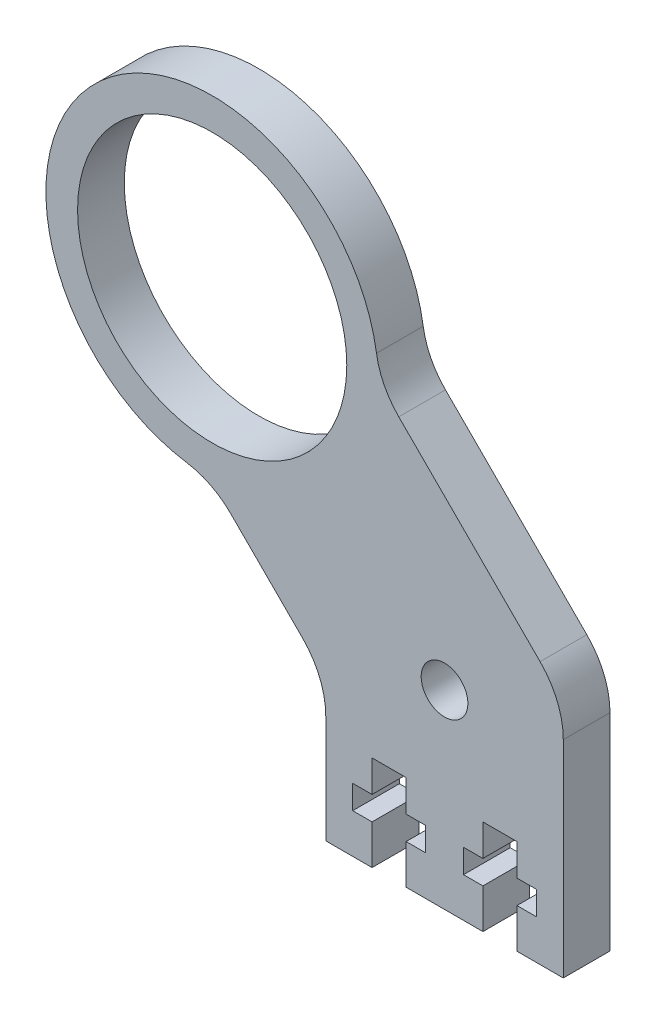
ISO-10303-21;
HEADER;
FILE_DESCRIPTION(('STEP AP214'),'2;1');
FILE_NAME('part.step','',(''),(''),'','','');
FILE_SCHEMA(('AUTOMOTIVE_DESIGN { 1 0 10303 214 1 1 1 1 }'));
ENDSEC;
DATA;
#1=APPLICATION_CONTEXT('core data for automotive mechanical design processes');
#2=APPLICATION_PROTOCOL_DEFINITION('international standard','automotive_design',2000,#1);
#3=PRODUCT_CONTEXT('',#1,'mechanical');
#4=PRODUCT('Part','Part','',(#3));
#5=PRODUCT_RELATED_PRODUCT_CATEGORY('part','',(#4));
#6=PRODUCT_DEFINITION_FORMATION('','',#4);
#7=PRODUCT_DEFINITION_CONTEXT('part definition',#1,'design');
#8=PRODUCT_DEFINITION('design','',#6,#7);
#9=PRODUCT_DEFINITION_SHAPE('','',#8);
#10=(LENGTH_UNIT() NAMED_UNIT(*) SI_UNIT(.MILLI.,.METRE.));
#11=(NAMED_UNIT(*) PLANE_ANGLE_UNIT() SI_UNIT($,.RADIAN.));
#12=(NAMED_UNIT(*) SI_UNIT($,.STERADIAN.) SOLID_ANGLE_UNIT());
#13=UNCERTAINTY_MEASURE_WITH_UNIT(LENGTH_MEASURE(1.E-05),#10,'distance_accuracy_value','');
#14=(GEOMETRIC_REPRESENTATION_CONTEXT(3) GLOBAL_UNCERTAINTY_ASSIGNED_CONTEXT((#13)) GLOBAL_UNIT_ASSIGNED_CONTEXT((#10,
#11,#12)) REPRESENTATION_CONTEXT('',''));
#15=CARTESIAN_POINT('',(0.,0.,0.));
#16=DIRECTION('',(0.,0.,1.));
#17=DIRECTION('',(1.,0.,0.));
#18=AXIS2_PLACEMENT_3D('',#15,#16,#17);
#19=CARTESIAN_POINT('',(-15.,-24.,5.9));
#20=DIRECTION('',(0.,1.,0.));
#21=DIRECTION('',(-1.,0.,0.));
#22=AXIS2_PLACEMENT_3D('',#19,#20,#21);
#23=PLANE('',#22);
#24=DIRECTION('',(1.,0.,0.));
#25=VECTOR('',#24,1.);
#26=CARTESIAN_POINT('',(-15.,-24.,5.9));
#27=LINE('',#26,#25);
#28=CARTESIAN_POINT('',(9.15000000000001,-24.,5.9));
#29=VERTEX_POINT('',#28);
#30=CARTESIAN_POINT('',(15.,-24.,5.9));
#31=VERTEX_POINT('',#30);
#32=EDGE_CURVE('E466',#29,#31,#27,.T.);
#33=ORIENTED_EDGE('',*,*,#32,.F.);
#34=DIRECTION('',(0.,0.,1.));
#35=VECTOR('',#34,1.);
#36=CARTESIAN_POINT('',(9.15000000000001,-24.,0.));
#37=LINE('',#36,#35);
#38=CARTESIAN_POINT('',(9.15000000000001,-24.,0.));
#39=VERTEX_POINT('',#38);
#40=EDGE_CURVE('E348',#39,#29,#37,.T.);
#41=ORIENTED_EDGE('',*,*,#40,.F.);
#42=DIRECTION('',(1.,0.,0.));
#43=VECTOR('',#42,1.);
#44=CARTESIAN_POINT('',(-15.,-24.,0.));
#45=LINE('',#44,#43);
#46=CARTESIAN_POINT('',(15.,-24.,0.));
#47=VERTEX_POINT('',#46);
#48=EDGE_CURVE('E483',#39,#47,#45,.T.);
#49=ORIENTED_EDGE('',*,*,#48,.T.);
#50=DIRECTION('',(0.,0.,-1.));
#51=VECTOR('',#50,1.);
#52=CARTESIAN_POINT('',(15.,-24.,5.9));
#53=LINE('',#52,#51);
#54=EDGE_CURVE('E476',#31,#47,#53,.T.);
#55=ORIENTED_EDGE('',*,*,#54,.F.);
#56=EDGE_LOOP('',(#33,#41,#49,#55));
#57=FACE_BOUND('',#56,.T.);
#58=ADVANCED_FACE('F32',(#57),#23,.F.);
#59=CARTESIAN_POINT('',(-15.,-24.,0.));
#60=VERTEX_POINT('',#59);
#61=CARTESIAN_POINT('',(-9.15,-24.,0.));
#62=VERTEX_POINT('',#61);
#63=EDGE_CURVE('E484',#60,#62,#45,.T.);
#64=ORIENTED_EDGE('',*,*,#63,.T.);
#65=DIRECTION('',(0.,0.,1.));
#66=VECTOR('',#65,1.);
#67=CARTESIAN_POINT('',(-9.15,-24.,0.));
#68=LINE('',#67,#66);
#69=CARTESIAN_POINT('',(-9.15,-24.,5.9));
#70=VERTEX_POINT('',#69);
#71=EDGE_CURVE('E390',#62,#70,#68,.T.);
#72=ORIENTED_EDGE('',*,*,#71,.T.);
#73=CARTESIAN_POINT('',(-15.,-24.,5.9));
#74=VERTEX_POINT('',#73);
#75=EDGE_CURVE('E467',#74,#70,#27,.T.);
#76=ORIENTED_EDGE('',*,*,#75,.F.);
#77=DIRECTION('',(0.,0.,-1.));
#78=VECTOR('',#77,1.);
#79=CARTESIAN_POINT('',(-15.,-24.,5.9));
#80=LINE('',#79,#78);
#81=EDGE_CURVE('E495',#74,#60,#80,.T.);
#82=ORIENTED_EDGE('',*,*,#81,.T.);
#83=EDGE_LOOP('',(#64,#72,#76,#82));
#84=FACE_BOUND('',#83,.T.);
#85=ADVANCED_FACE('F562',(#84),#23,.F.);
#86=CARTESIAN_POINT('',(-29.3449314192418,29.3449314192417,5.9));
#87=DIRECTION('',(0.,0.,1.));
#88=DIRECTION('',(1.,0.,0.));
#89=AXIS2_PLACEMENT_3D('',#86,#87,#88);
#90=PLANE('',#89);
#91=DIRECTION('',(0.,1.,0.));
#92=VECTOR('',#91,1.);
#93=CARTESIAN_POINT('',(15.,-24.,5.9));
#94=LINE('',#93,#92);
#95=CARTESIAN_POINT('',(15.,2.07106781186547,5.9));
#96=VERTEX_POINT('',#95);
#97=EDGE_CURVE('E470',#31,#96,#94,.T.);
#98=ORIENTED_EDGE('',*,*,#97,.T.);
#99=CARTESIAN_POINT('',(5.,2.07106781186548,5.9));
#100=DIRECTION('',(0.,0.,1.));
#101=DIRECTION('',(1.,0.,0.));
#102=AXIS2_PLACEMENT_3D('',#99,#100,#101);
#103=CIRCLE('',#102,10.);
#104=CARTESIAN_POINT('',(12.0710678118655,9.14213562373097,5.9));
#105=VERTEX_POINT('',#104);
#106=EDGE_CURVE('E515',#96,#105,#103,.T.);
#107=ORIENTED_EDGE('',*,*,#106,.T.);
#108=DIRECTION('',(-0.707106781186549,0.707106781186546,0.));
#109=VECTOR('',#108,1.);
#110=CARTESIAN_POINT('',(15.,6.21320343559644,5.9));
#111=LINE('',#110,#109);
#112=CARTESIAN_POINT('',(-5.77684830462785,26.9900517402242,5.9));
#113=VERTEX_POINT('',#112);
#114=EDGE_CURVE('E474',#105,#113,#111,.T.);
#115=ORIENTED_EDGE('',*,*,#114,.T.);
#116=CARTESIAN_POINT('',(1.29421950723761,34.0611195520897,5.9));
#117=DIRECTION('',(0.,0.,1.));
#118=DIRECTION('',(1.,0.,0.));
#119=AXIS2_PLACEMENT_3D('',#116,#117,#118);
#120=CIRCLE('',#119,10.);
#121=CARTESIAN_POINT('',(-8.58937756582026,32.5397685414936,5.9));
#122=VERTEX_POINT('',#121);
#123=EDGE_CURVE('E11',#113,#122,#120,.F.);
#124=ORIENTED_EDGE('',*,*,#123,.T.);
#125=CARTESIAN_POINT('',(-29.3449314192418,29.3449314192417,5.9));
#126=DIRECTION('',(0.,0.,1.));
#127=DIRECTION('',(1.,0.,0.));
#128=AXIS2_PLACEMENT_3D('',#125,#126,#127);
#129=CIRCLE('',#128,21.);
#130=CARTESIAN_POINT('',(-32.5397685414936,8.58937756582013,5.9));
#131=VERTEX_POINT('',#130);
#132=EDGE_CURVE('E458',#122,#131,#129,.T.);
#133=ORIENTED_EDGE('',*,*,#132,.T.);
#134=CARTESIAN_POINT('',(-34.0611195520897,-1.29421950723775,5.9));
#135=DIRECTION('',(0.,0.,1.));
#136=DIRECTION('',(1.,0.,0.));
#137=AXIS2_PLACEMENT_3D('',#134,#135,#136);
#138=CIRCLE('',#137,10.);
#139=CARTESIAN_POINT('',(-26.9900517402242,5.77684830462774,5.9));
#140=VERTEX_POINT('',#139);
#141=EDGE_CURVE('E527',#131,#140,#138,.F.);
#142=ORIENTED_EDGE('',*,*,#141,.T.);
#143=DIRECTION('',(0.707106781186549,-0.707106781186546,0.));
#144=VECTOR('',#143,1.);
#145=CARTESIAN_POINT('',(-15.,-6.21320343559644,5.9));
#146=LINE('',#145,#144);
#147=CARTESIAN_POINT('',(-17.9289321881345,-3.28427124746192,5.9));
#148=VERTEX_POINT('',#147);
#149=EDGE_CURVE('E460',#140,#148,#146,.T.);
#150=ORIENTED_EDGE('',*,*,#149,.T.);
#151=CARTESIAN_POINT('',(-25.,-10.3553390593274,5.9));
#152=DIRECTION('',(0.,0.,1.));
#153=DIRECTION('',(1.,0.,0.));
#154=AXIS2_PLACEMENT_3D('',#151,#152,#153);
#155=CIRCLE('',#154,10.);
#156=CARTESIAN_POINT('',(-15.,-10.3553390593274,5.9));
#157=VERTEX_POINT('',#156);
#158=EDGE_CURVE('E523',#148,#157,#155,.F.);
#159=ORIENTED_EDGE('',*,*,#158,.T.);
#160=DIRECTION('',(0.,-1.,0.));
#161=VECTOR('',#160,1.);
#162=CARTESIAN_POINT('',(-15.,-6.21320343559644,5.9));
#163=LINE('',#162,#161);
#164=EDGE_CURVE('E464',#157,#74,#163,.T.);
#165=ORIENTED_EDGE('',*,*,#164,.T.);
#166=ORIENTED_EDGE('',*,*,#75,.T.);
#167=DIRECTION('',(0.,-1.,0.));
#168=VECTOR('',#167,1.);
#169=CARTESIAN_POINT('',(-9.15,-24.,5.9));
#170=LINE('',#169,#168);
#171=CARTESIAN_POINT('',(-9.15,-19.,5.9));
#172=VERTEX_POINT('',#171);
#173=EDGE_CURVE('E335',#172,#70,#170,.T.);
#174=ORIENTED_EDGE('',*,*,#173,.F.);
#175=DIRECTION('',(1.,0.,0.));
#176=VECTOR('',#175,1.);
#177=CARTESIAN_POINT('',(-11.6,-19.,5.9));
#178=LINE('',#177,#176);
#179=CARTESIAN_POINT('',(-11.6,-19.,5.9));
#180=VERTEX_POINT('',#179);
#181=EDGE_CURVE('E360',#180,#172,#178,.T.);
#182=ORIENTED_EDGE('',*,*,#181,.F.);
#183=DIRECTION('',(0.,-1.,0.));
#184=VECTOR('',#183,1.);
#185=CARTESIAN_POINT('',(-11.6,-16.,5.9));
#186=LINE('',#185,#184);
#187=CARTESIAN_POINT('',(-11.6,-16.,5.9));
#188=VERTEX_POINT('',#187);
#189=EDGE_CURVE('E416',#188,#180,#186,.T.);
#190=ORIENTED_EDGE('',*,*,#189,.F.);
#191=DIRECTION('',(-1.,0.,0.));
#192=VECTOR('',#191,1.);
#193=CARTESIAN_POINT('',(-11.6,-16.,5.9));
#194=LINE('',#193,#192);
#195=CARTESIAN_POINT('',(-9.15,-16.,5.9));
#196=VERTEX_POINT('',#195);
#197=EDGE_CURVE('E413',#196,#188,#194,.T.);
#198=ORIENTED_EDGE('',*,*,#197,.F.);
#199=DIRECTION('',(0.,-1.,0.));
#200=VECTOR('',#199,1.);
#201=CARTESIAN_POINT('',(-9.15,-16.,5.9));
#202=LINE('',#201,#200);
#203=CARTESIAN_POINT('',(-9.15,-12.,5.9));
#204=VERTEX_POINT('',#203);
#205=EDGE_CURVE('E410',#204,#196,#202,.T.);
#206=ORIENTED_EDGE('',*,*,#205,.F.);
#207=DIRECTION('',(-1.,0.,0.));
#208=VECTOR('',#207,1.);
#209=CARTESIAN_POINT('',(-9.15,-12.,5.9));
#210=LINE('',#209,#208);
#211=CARTESIAN_POINT('',(-4.85,-12.,5.9));
#212=VERTEX_POINT('',#211);
#213=EDGE_CURVE('E407',#212,#204,#210,.T.);
#214=ORIENTED_EDGE('',*,*,#213,.F.);
#215=DIRECTION('',(0.,1.,0.));
#216=VECTOR('',#215,1.);
#217=CARTESIAN_POINT('',(-4.85,-16.,5.9));
#218=LINE('',#217,#216);
#219=CARTESIAN_POINT('',(-4.85,-16.,5.9));
#220=VERTEX_POINT('',#219);
#221=EDGE_CURVE('E404',#220,#212,#218,.T.);
#222=ORIENTED_EDGE('',*,*,#221,.F.);
#223=DIRECTION('',(-1.,0.,0.));
#224=VECTOR('',#223,1.);
#225=CARTESIAN_POINT('',(-4.85,-16.,5.9));
#226=LINE('',#225,#224);
#227=CARTESIAN_POINT('',(-2.4,-16.,5.9));
#228=VERTEX_POINT('',#227);
#229=EDGE_CURVE('E401',#228,#220,#226,.T.);
#230=ORIENTED_EDGE('',*,*,#229,.F.);
#231=DIRECTION('',(0.,1.,0.));
#232=VECTOR('',#231,1.);
#233=CARTESIAN_POINT('',(-2.4,-16.,5.9));
#234=LINE('',#233,#232);
#235=CARTESIAN_POINT('',(-2.4,-19.,5.9));
#236=VERTEX_POINT('',#235);
#237=EDGE_CURVE('E398',#236,#228,#234,.T.);
#238=ORIENTED_EDGE('',*,*,#237,.F.);
#239=DIRECTION('',(1.,0.,0.));
#240=VECTOR('',#239,1.);
#241=CARTESIAN_POINT('',(-4.85,-19.,5.9));
#242=LINE('',#241,#240);
#243=CARTESIAN_POINT('',(-4.85,-19.,5.9));
#244=VERTEX_POINT('',#243);
#245=EDGE_CURVE('E395',#244,#236,#242,.T.);
#246=ORIENTED_EDGE('',*,*,#245,.F.);
#247=DIRECTION('',(0.,1.,0.));
#248=VECTOR('',#247,1.);
#249=CARTESIAN_POINT('',(-4.84999999999999,-24.,5.9));
#250=LINE('',#249,#248);
#251=CARTESIAN_POINT('',(-4.84999999999999,-24.,5.9));
#252=VERTEX_POINT('',#251);
#253=EDGE_CURVE('E392',#252,#244,#250,.T.);
#254=ORIENTED_EDGE('',*,*,#253,.F.);
#255=CARTESIAN_POINT('',(4.85,-24.,5.9));
#256=VERTEX_POINT('',#255);
#257=EDGE_CURVE('E471',#252,#256,#27,.T.);
#258=ORIENTED_EDGE('',*,*,#257,.T.);
#259=DIRECTION('',(0.,-1.,0.));
#260=VECTOR('',#259,1.);
#261=CARTESIAN_POINT('',(4.85,-24.,5.9));
#262=LINE('',#261,#260);
#263=CARTESIAN_POINT('',(4.85,-19.,5.9));
#264=VERTEX_POINT('',#263);
#265=EDGE_CURVE('E314',#264,#256,#262,.T.);
#266=ORIENTED_EDGE('',*,*,#265,.F.);
#267=DIRECTION('',(1.,0.,0.));
#268=VECTOR('',#267,1.);
#269=CARTESIAN_POINT('',(4.85,-19.,5.9));
#270=LINE('',#269,#268);
#271=CARTESIAN_POINT('',(2.4,-19.,5.9));
#272=VERTEX_POINT('',#271);
#273=EDGE_CURVE('E311',#272,#264,#270,.T.);
#274=ORIENTED_EDGE('',*,*,#273,.F.);
#275=DIRECTION('',(0.,-1.,0.));
#276=VECTOR('',#275,1.);
#277=CARTESIAN_POINT('',(2.4,-16.,5.9));
#278=LINE('',#277,#276);
#279=CARTESIAN_POINT('',(2.4,-16.,5.9));
#280=VERTEX_POINT('',#279);
#281=EDGE_CURVE('E309',#280,#272,#278,.T.);
#282=ORIENTED_EDGE('',*,*,#281,.F.);
#283=DIRECTION('',(-1.,0.,0.));
#284=VECTOR('',#283,1.);
#285=CARTESIAN_POINT('',(4.85,-16.,5.9));
#286=LINE('',#285,#284);
#287=CARTESIAN_POINT('',(4.85,-16.,5.9));
#288=VERTEX_POINT('',#287);
#289=EDGE_CURVE('E260',#288,#280,#286,.T.);
#290=ORIENTED_EDGE('',*,*,#289,.F.);
#291=DIRECTION('',(0.,-1.,0.));
#292=VECTOR('',#291,1.);
#293=CARTESIAN_POINT('',(4.85,-16.,5.9));
#294=LINE('',#293,#292);
#295=CARTESIAN_POINT('',(4.85,-12.,5.9));
#296=VERTEX_POINT('',#295);
#297=EDGE_CURVE('E280',#296,#288,#294,.T.);
#298=ORIENTED_EDGE('',*,*,#297,.F.);
#299=DIRECTION('',(-1.,0.,0.));
#300=VECTOR('',#299,1.);
#301=CARTESIAN_POINT('',(9.15,-12.,5.9));
#302=LINE('',#301,#300);
#303=CARTESIAN_POINT('',(9.15,-12.,5.9));
#304=VERTEX_POINT('',#303);
#305=EDGE_CURVE('E283',#304,#296,#302,.T.);
#306=ORIENTED_EDGE('',*,*,#305,.F.);
#307=DIRECTION('',(0.,1.,0.));
#308=VECTOR('',#307,1.);
#309=CARTESIAN_POINT('',(9.15,-16.,5.9));
#310=LINE('',#309,#308);
#311=CARTESIAN_POINT('',(9.15,-16.,5.9));
#312=VERTEX_POINT('',#311);
#313=EDGE_CURVE('E328',#312,#304,#310,.T.);
#314=ORIENTED_EDGE('',*,*,#313,.F.);
#315=DIRECTION('',(-1.,0.,0.));
#316=VECTOR('',#315,1.);
#317=CARTESIAN_POINT('',(11.6,-16.,5.9));
#318=LINE('',#317,#316);
#319=CARTESIAN_POINT('',(11.6,-16.,5.9));
#320=VERTEX_POINT('',#319);
#321=EDGE_CURVE('E325',#320,#312,#318,.T.);
#322=ORIENTED_EDGE('',*,*,#321,.F.);
#323=DIRECTION('',(0.,1.,0.));
#324=VECTOR('',#323,1.);
#325=CARTESIAN_POINT('',(11.6,-16.,5.9));
#326=LINE('',#325,#324);
#327=CARTESIAN_POINT('',(11.6,-19.,5.9));
#328=VERTEX_POINT('',#327);
#329=EDGE_CURVE('E322',#328,#320,#326,.T.);
#330=ORIENTED_EDGE('',*,*,#329,.F.);
#331=DIRECTION('',(1.,0.,0.));
#332=VECTOR('',#331,1.);
#333=CARTESIAN_POINT('',(11.6,-19.,5.9));
#334=LINE('',#333,#332);
#335=CARTESIAN_POINT('',(9.15,-19.,5.9));
#336=VERTEX_POINT('',#335);
#337=EDGE_CURVE('E319',#336,#328,#334,.T.);
#338=ORIENTED_EDGE('',*,*,#337,.F.);
#339=DIRECTION('',(0.,1.,0.));
#340=VECTOR('',#339,1.);
#341=CARTESIAN_POINT('',(9.15000000000001,-24.,5.9));
#342=LINE('',#341,#340);
#343=EDGE_CURVE('E316',#29,#336,#342,.T.);
#344=ORIENTED_EDGE('',*,*,#343,.F.);
#345=ORIENTED_EDGE('',*,*,#32,.T.);
#346=EDGE_LOOP('',(#98,#107,#115,#124,#133,#142,#150,#159,#165,#166,#174,#182,#190,#198,#206,
#214,#222,#230,#238,#246,#254,#258,#266,#274,#282,#290,#298,#306,#314,#322,#330,#338,#344,#345));
#347=FACE_BOUND('',#346,.T.);
#348=CARTESIAN_POINT('',(-29.3449314192418,29.3449314192417,5.9));
#349=DIRECTION('',(0.,0.,1.));
#350=DIRECTION('',(1.,0.,0.));
#351=AXIS2_PLACEMENT_3D('',#348,#349,#350);
#352=CIRCLE('',#351,17.);
#353=CARTESIAN_POINT('',(-12.3449314192418,29.3449314192417,5.9));
#354=VERTEX_POINT('',#353);
#355=EDGE_CURVE('E423',#354,#354,#352,.T.);
#356=ORIENTED_EDGE('',*,*,#355,.F.);
#357=EDGE_LOOP('',(#356));
#358=FACE_BOUND('',#357,.T.);
#359=CARTESIAN_POINT('',(0.,0.,5.9));
#360=DIRECTION('',(0.,0.,1.));
#361=DIRECTION('',(1.,0.,0.));
#362=AXIS2_PLACEMENT_3D('',#359,#360,#361);
#363=CIRCLE('',#362,2.95);
#364=CARTESIAN_POINT('',(2.95,0.,5.9));
#365=VERTEX_POINT('',#364);
#366=EDGE_CURVE('E452',#365,#365,#363,.T.);
#367=ORIENTED_EDGE('',*,*,#366,.F.);
#368=EDGE_LOOP('',(#367));
#369=FACE_BOUND('',#368,.T.);
#370=ADVANCED_FACE('F538',(#347,#358,#369),#90,.T.);
#371=CARTESIAN_POINT('',(-29.3449314192418,29.3449314192417,0.));
#372=DIRECTION('',(0.,0.,1.));
#373=DIRECTION('',(1.,0.,0.));
#374=AXIS2_PLACEMENT_3D('',#371,#372,#373);
#375=PLANE('',#374);
#376=DIRECTION('',(-0.707106781186549,0.707106781186546,0.));
#377=VECTOR('',#376,1.);
#378=CARTESIAN_POINT('',(15.,6.21320343559644,0.));
#379=LINE('',#378,#377);
#380=CARTESIAN_POINT('',(12.0710678118655,9.14213562373097,0.));
#381=VERTEX_POINT('',#380);
#382=CARTESIAN_POINT('',(-5.77684830462785,26.9900517402242,0.));
#383=VERTEX_POINT('',#382);
#384=EDGE_CURVE('E461',#381,#383,#379,.T.);
#385=ORIENTED_EDGE('',*,*,#384,.F.);
#386=CARTESIAN_POINT('',(5.,2.07106781186548,0.));
#387=DIRECTION('',(0.,0.,1.));
#388=DIRECTION('',(1.,0.,0.));
#389=AXIS2_PLACEMENT_3D('',#386,#387,#388);
#390=CIRCLE('',#389,10.);
#391=CARTESIAN_POINT('',(15.,2.07106781186547,0.));
#392=VERTEX_POINT('',#391);
#393=EDGE_CURVE('E511',#381,#392,#390,.F.);
#394=ORIENTED_EDGE('',*,*,#393,.T.);
#395=DIRECTION('',(0.,1.,0.));
#396=VECTOR('',#395,1.);
#397=CARTESIAN_POINT('',(15.,-24.,0.));
#398=LINE('',#397,#396);
#399=EDGE_CURVE('E487',#47,#392,#398,.T.);
#400=ORIENTED_EDGE('',*,*,#399,.F.);
#401=ORIENTED_EDGE('',*,*,#48,.F.);
#402=DIRECTION('',(0.,1.,0.));
#403=VECTOR('',#402,1.);
#404=CARTESIAN_POINT('',(9.15000000000001,-24.,0.));
#405=LINE('',#404,#403);
#406=CARTESIAN_POINT('',(9.15,-19.,0.));
#407=VERTEX_POINT('',#406);
#408=EDGE_CURVE('E290',#39,#407,#405,.T.);
#409=ORIENTED_EDGE('',*,*,#408,.T.);
#410=DIRECTION('',(1.,0.,0.));
#411=VECTOR('',#410,1.);
#412=CARTESIAN_POINT('',(11.6,-19.,0.));
#413=LINE('',#412,#411);
#414=CARTESIAN_POINT('',(11.6,-19.,0.));
#415=VERTEX_POINT('',#414);
#416=EDGE_CURVE('E293',#407,#415,#413,.T.);
#417=ORIENTED_EDGE('',*,*,#416,.T.);
#418=DIRECTION('',(0.,1.,0.));
#419=VECTOR('',#418,1.);
#420=CARTESIAN_POINT('',(11.6,-16.,0.));
#421=LINE('',#420,#419);
#422=CARTESIAN_POINT('',(11.6,-16.,0.));
#423=VERTEX_POINT('',#422);
#424=EDGE_CURVE('E296',#415,#423,#421,.T.);
#425=ORIENTED_EDGE('',*,*,#424,.T.);
#426=DIRECTION('',(-1.,0.,0.));
#427=VECTOR('',#426,1.);
#428=CARTESIAN_POINT('',(11.6,-16.,0.));
#429=LINE('',#428,#427);
#430=CARTESIAN_POINT('',(9.15,-16.,0.));
#431=VERTEX_POINT('',#430);
#432=EDGE_CURVE('E299',#423,#431,#429,.T.);
#433=ORIENTED_EDGE('',*,*,#432,.T.);
#434=DIRECTION('',(0.,1.,0.));
#435=VECTOR('',#434,1.);
#436=CARTESIAN_POINT('',(9.15,-16.,0.));
#437=LINE('',#436,#435);
#438=CARTESIAN_POINT('',(9.15,-12.,0.));
#439=VERTEX_POINT('',#438);
#440=EDGE_CURVE('E302',#431,#439,#437,.T.);
#441=ORIENTED_EDGE('',*,*,#440,.T.);
#442=DIRECTION('',(-1.,0.,0.));
#443=VECTOR('',#442,1.);
#444=CARTESIAN_POINT('',(9.15,-12.,0.));
#445=LINE('',#444,#443);
#446=CARTESIAN_POINT('',(4.85,-12.,0.));
#447=VERTEX_POINT('',#446);
#448=EDGE_CURVE('E305',#439,#447,#445,.T.);
#449=ORIENTED_EDGE('',*,*,#448,.T.);
#450=DIRECTION('',(0.,-1.,0.));
#451=VECTOR('',#450,1.);
#452=CARTESIAN_POINT('',(4.85,-16.,0.));
#453=LINE('',#452,#451);
#454=CARTESIAN_POINT('',(4.85,-16.,0.));
#455=VERTEX_POINT('',#454);
#456=EDGE_CURVE('E265',#447,#455,#453,.T.);
#457=ORIENTED_EDGE('',*,*,#456,.T.);
#458=DIRECTION('',(-1.,0.,0.));
#459=VECTOR('',#458,1.);
#460=CARTESIAN_POINT('',(4.85,-16.,0.));
#461=LINE('',#460,#459);
#462=CARTESIAN_POINT('',(2.4,-16.,0.));
#463=VERTEX_POINT('',#462);
#464=EDGE_CURVE('E257',#455,#463,#461,.T.);
#465=ORIENTED_EDGE('',*,*,#464,.T.);
#466=DIRECTION('',(0.,-1.,0.));
#467=VECTOR('',#466,1.);
#468=CARTESIAN_POINT('',(2.4,-16.,0.));
#469=LINE('',#468,#467);
#470=CARTESIAN_POINT('',(2.4,-19.,0.));
#471=VERTEX_POINT('',#470);
#472=EDGE_CURVE('E268',#463,#471,#469,.T.);
#473=ORIENTED_EDGE('',*,*,#472,.T.);
#474=DIRECTION('',(1.,0.,0.));
#475=VECTOR('',#474,1.);
#476=CARTESIAN_POINT('',(4.85,-19.,0.));
#477=LINE('',#476,#475);
#478=CARTESIAN_POINT('',(4.85,-19.,0.));
#479=VERTEX_POINT('',#478);
#480=EDGE_CURVE('E273',#471,#479,#477,.T.);
#481=ORIENTED_EDGE('',*,*,#480,.T.);
#482=DIRECTION('',(0.,-1.,0.));
#483=VECTOR('',#482,1.);
#484=CARTESIAN_POINT('',(4.85,-24.,0.));
#485=LINE('',#484,#483);
#486=CARTESIAN_POINT('',(4.85,-24.,0.));
#487=VERTEX_POINT('',#486);
#488=EDGE_CURVE('E287',#479,#487,#485,.T.);
#489=ORIENTED_EDGE('',*,*,#488,.T.);
#490=CARTESIAN_POINT('',(-4.85,-24.,0.));
#491=VERTEX_POINT('',#490);
#492=EDGE_CURVE('E488',#491,#487,#45,.T.);
#493=ORIENTED_EDGE('',*,*,#492,.F.);
#494=DIRECTION('',(0.,1.,0.));
#495=VECTOR('',#494,1.);
#496=CARTESIAN_POINT('',(-4.84999999999999,-24.,0.));
#497=LINE('',#496,#495);
#498=CARTESIAN_POINT('',(-4.85,-19.,0.));
#499=VERTEX_POINT('',#498);
#500=EDGE_CURVE('E359',#491,#499,#497,.T.);
#501=ORIENTED_EDGE('',*,*,#500,.T.);
#502=DIRECTION('',(1.,0.,0.));
#503=VECTOR('',#502,1.);
#504=CARTESIAN_POINT('',(-4.85,-19.,0.));
#505=LINE('',#504,#503);
#506=CARTESIAN_POINT('',(-2.4,-19.,0.));
#507=VERTEX_POINT('',#506);
#508=EDGE_CURVE('E363',#499,#507,#505,.T.);
#509=ORIENTED_EDGE('',*,*,#508,.T.);
#510=DIRECTION('',(0.,1.,0.));
#511=VECTOR('',#510,1.);
#512=CARTESIAN_POINT('',(-2.4,-16.,0.));
#513=LINE('',#512,#511);
#514=CARTESIAN_POINT('',(-2.4,-16.,0.));
#515=VERTEX_POINT('',#514);
#516=EDGE_CURVE('E366',#507,#515,#513,.T.);
#517=ORIENTED_EDGE('',*,*,#516,.T.);
#518=DIRECTION('',(-1.,0.,0.));
#519=VECTOR('',#518,1.);
#520=CARTESIAN_POINT('',(-4.85,-16.,0.));
#521=LINE('',#520,#519);
#522=CARTESIAN_POINT('',(-4.85,-16.,0.));
#523=VERTEX_POINT('',#522);
#524=EDGE_CURVE('E369',#515,#523,#521,.T.);
#525=ORIENTED_EDGE('',*,*,#524,.T.);
#526=DIRECTION('',(0.,1.,0.));
#527=VECTOR('',#526,1.);
#528=CARTESIAN_POINT('',(-4.85,-16.,0.));
#529=LINE('',#528,#527);
#530=CARTESIAN_POINT('',(-4.85,-12.,0.));
#531=VERTEX_POINT('',#530);
#532=EDGE_CURVE('E372',#523,#531,#529,.T.);
#533=ORIENTED_EDGE('',*,*,#532,.T.);
#534=DIRECTION('',(-1.,0.,0.));
#535=VECTOR('',#534,1.);
#536=CARTESIAN_POINT('',(-9.15,-12.,0.));
#537=LINE('',#536,#535);
#538=CARTESIAN_POINT('',(-9.15,-12.,0.));
#539=VERTEX_POINT('',#538);
#540=EDGE_CURVE('E375',#531,#539,#537,.T.);
#541=ORIENTED_EDGE('',*,*,#540,.T.);
#542=DIRECTION('',(0.,-1.,0.));
#543=VECTOR('',#542,1.);
#544=CARTESIAN_POINT('',(-9.15,-16.,0.));
#545=LINE('',#544,#543);
#546=CARTESIAN_POINT('',(-9.15,-16.,0.));
#547=VERTEX_POINT('',#546);
#548=EDGE_CURVE('E378',#539,#547,#545,.T.);
#549=ORIENTED_EDGE('',*,*,#548,.T.);
#550=DIRECTION('',(-1.,0.,0.));
#551=VECTOR('',#550,1.);
#552=CARTESIAN_POINT('',(-11.6,-16.,0.));
#553=LINE('',#552,#551);
#554=CARTESIAN_POINT('',(-11.6,-16.,0.));
#555=VERTEX_POINT('',#554);
#556=EDGE_CURVE('E381',#547,#555,#553,.T.);
#557=ORIENTED_EDGE('',*,*,#556,.T.);
#558=DIRECTION('',(0.,-1.,0.));
#559=VECTOR('',#558,1.);
#560=CARTESIAN_POINT('',(-11.6,-16.,0.));
#561=LINE('',#560,#559);
#562=CARTESIAN_POINT('',(-11.6,-19.,0.));
#563=VERTEX_POINT('',#562);
#564=EDGE_CURVE('E384',#555,#563,#561,.T.);
#565=ORIENTED_EDGE('',*,*,#564,.T.);
#566=DIRECTION('',(1.,0.,0.));
#567=VECTOR('',#566,1.);
#568=CARTESIAN_POINT('',(-11.6,-19.,0.));
#569=LINE('',#568,#567);
#570=CARTESIAN_POINT('',(-9.15,-19.,0.));
#571=VERTEX_POINT('',#570);
#572=EDGE_CURVE('E387',#563,#571,#569,.T.);
#573=ORIENTED_EDGE('',*,*,#572,.T.);
#574=DIRECTION('',(0.,-1.,0.));
#575=VECTOR('',#574,1.);
#576=CARTESIAN_POINT('',(-9.15,-24.,0.));
#577=LINE('',#576,#575);
#578=EDGE_CURVE('E356',#571,#62,#577,.T.);
#579=ORIENTED_EDGE('',*,*,#578,.T.);
#580=ORIENTED_EDGE('',*,*,#63,.F.);
#581=DIRECTION('',(0.,-1.,0.));
#582=VECTOR('',#581,1.);
#583=CARTESIAN_POINT('',(-15.,-6.21320343559644,0.));
#584=LINE('',#583,#582);
#585=CARTESIAN_POINT('',(-15.,-10.3553390593274,0.));
#586=VERTEX_POINT('',#585);
#587=EDGE_CURVE('E481',#586,#60,#584,.T.);
#588=ORIENTED_EDGE('',*,*,#587,.F.);
#589=CARTESIAN_POINT('',(-25.,-10.3553390593274,0.));
#590=DIRECTION('',(0.,0.,1.));
#591=DIRECTION('',(1.,0.,0.));
#592=AXIS2_PLACEMENT_3D('',#589,#590,#591);
#593=CIRCLE('',#592,10.);
#594=CARTESIAN_POINT('',(-17.9289321881345,-3.28427124746192,0.));
#595=VERTEX_POINT('',#594);
#596=EDGE_CURVE('E521',#586,#595,#593,.T.);
#597=ORIENTED_EDGE('',*,*,#596,.T.);
#598=DIRECTION('',(0.707106781186549,-0.707106781186546,0.));
#599=VECTOR('',#598,1.);
#600=CARTESIAN_POINT('',(-15.,-6.21320343559644,0.));
#601=LINE('',#600,#599);
#602=CARTESIAN_POINT('',(-26.9900517402242,5.77684830462774,0.));
#603=VERTEX_POINT('',#602);
#604=EDGE_CURVE('E478',#603,#595,#601,.T.);
#605=ORIENTED_EDGE('',*,*,#604,.F.);
#606=CARTESIAN_POINT('',(-34.0611195520897,-1.29421950723775,0.));
#607=DIRECTION('',(0.,0.,1.));
#608=DIRECTION('',(1.,0.,0.));
#609=AXIS2_PLACEMENT_3D('',#606,#607,#608);
#610=CIRCLE('',#609,10.);
#611=CARTESIAN_POINT('',(-32.5397685414936,8.58937756582013,0.));
#612=VERTEX_POINT('',#611);
#613=EDGE_CURVE('E525',#603,#612,#610,.T.);
#614=ORIENTED_EDGE('',*,*,#613,.T.);
#615=CARTESIAN_POINT('',(-29.3449314192418,29.3449314192417,0.));
#616=DIRECTION('',(0.,0.,1.));
#617=DIRECTION('',(1.,0.,0.));
#618=AXIS2_PLACEMENT_3D('',#615,#616,#617);
#619=CIRCLE('',#618,21.);
#620=CARTESIAN_POINT('',(-8.58937756582026,32.5397685414936,0.));
#621=VERTEX_POINT('',#620);
#622=EDGE_CURVE('E455',#621,#612,#619,.T.);
#623=ORIENTED_EDGE('',*,*,#622,.F.);
#624=CARTESIAN_POINT('',(1.29421950723761,34.0611195520897,0.));
#625=DIRECTION('',(0.,0.,1.));
#626=DIRECTION('',(1.,0.,0.));
#627=AXIS2_PLACEMENT_3D('',#624,#625,#626);
#628=CIRCLE('',#627,10.);
#629=EDGE_CURVE('E40',#621,#383,#628,.T.);
#630=ORIENTED_EDGE('',*,*,#629,.T.);
#631=EDGE_LOOP('',(#385,#394,#400,#401,#409,#417,#425,#433,#441,#449,#457,#465,#473,#481,#489,
#493,#501,#509,#517,#525,#533,#541,#549,#557,#565,#573,#579,#580,#588,#597,#605,#614,#623,#630));
#632=FACE_BOUND('',#631,.T.);
#633=CARTESIAN_POINT('',(-29.3449314192418,29.3449314192417,0.));
#634=DIRECTION('',(0.,0.,1.));
#635=DIRECTION('',(1.,0.,0.));
#636=AXIS2_PLACEMENT_3D('',#633,#634,#635);
#637=CIRCLE('',#636,17.);
#638=CARTESIAN_POINT('',(-12.3449314192418,29.3449314192417,0.));
#639=VERTEX_POINT('',#638);
#640=EDGE_CURVE('E446',#639,#639,#637,.T.);
#641=ORIENTED_EDGE('',*,*,#640,.T.);
#642=EDGE_LOOP('',(#641));
#643=FACE_BOUND('',#642,.T.);
#644=CARTESIAN_POINT('',(0.,0.,0.));
#645=DIRECTION('',(0.,0.,1.));
#646=DIRECTION('',(1.,0.,0.));
#647=AXIS2_PLACEMENT_3D('',#644,#645,#646);
#648=CIRCLE('',#647,2.95);
#649=CARTESIAN_POINT('',(2.95,0.,0.));
#650=VERTEX_POINT('',#649);
#651=EDGE_CURVE('E449',#650,#650,#648,.T.);
#652=ORIENTED_EDGE('',*,*,#651,.T.);
#653=EDGE_LOOP('',(#652));
#654=FACE_BOUND('',#653,.T.);
#655=ADVANCED_FACE('F276',(#632,#643,#654),#375,.F.);
#656=CARTESIAN_POINT('',(-29.3449314192418,29.3449314192417,5.9));
#657=DIRECTION('',(0.,0.,-1.));
#658=DIRECTION('',(-1.,0.,0.));
#659=AXIS2_PLACEMENT_3D('',#656,#657,#658);
#660=CYLINDRICAL_SURFACE('',#659,21.);
#661=ORIENTED_EDGE('',*,*,#622,.T.);
#662=DIRECTION('',(0.,0.,-1.));
#663=VECTOR('',#662,1.);
#664=CARTESIAN_POINT('',(-32.5397685414936,8.58937756582013,5.9));
#665=LINE('',#664,#663);
#666=EDGE_CURVE('E47',#612,#131,#665,.F.);
#667=ORIENTED_EDGE('',*,*,#666,.T.);
#668=ORIENTED_EDGE('',*,*,#132,.F.);
#669=DIRECTION('',(0.,0.,-1.));
#670=VECTOR('',#669,1.);
#671=CARTESIAN_POINT('',(-8.58937756582025,32.5397685414936,5.9));
#672=LINE('',#671,#670);
#673=EDGE_CURVE('E517',#122,#621,#672,.T.);
#674=ORIENTED_EDGE('',*,*,#673,.T.);
#675=EDGE_LOOP('',(#661,#667,#668,#674));
#676=FACE_BOUND('',#675,.T.);
#677=ADVANCED_FACE('F536',(#676),#660,.T.);
#678=CARTESIAN_POINT('',(-15.,-6.21320343559644,5.9));
#679=DIRECTION('',(0.707106781186546,0.707106781186549,0.));
#680=DIRECTION('',(-0.707106781186549,0.707106781186546,0.));
#681=AXIS2_PLACEMENT_3D('',#678,#679,#680);
#682=PLANE('',#681);
#683=ORIENTED_EDGE('',*,*,#604,.T.);
#684=DIRECTION('',(0.,0.,-1.));
#685=VECTOR('',#684,1.);
#686=CARTESIAN_POINT('',(-17.9289321881345,-3.28427124746192,5.9));
#687=LINE('',#686,#685);
#688=EDGE_CURVE('E504',#595,#148,#687,.F.);
#689=ORIENTED_EDGE('',*,*,#688,.T.);
#690=ORIENTED_EDGE('',*,*,#149,.F.);
#691=DIRECTION('',(0.,0.,1.));
#692=VECTOR('',#691,1.);
#693=CARTESIAN_POINT('',(-26.9900517402242,5.77684830462774,0.));
#694=LINE('',#693,#692);
#695=EDGE_CURVE('E501',#140,#603,#694,.F.);
#696=ORIENTED_EDGE('',*,*,#695,.T.);
#697=EDGE_LOOP('',(#683,#689,#690,#696));
#698=FACE_BOUND('',#697,.T.);
#699=ADVANCED_FACE('F546',(#698),#682,.F.);
#700=CARTESIAN_POINT('',(-15.,-6.21320343559644,5.9));
#701=DIRECTION('',(1.,0.,0.));
#702=DIRECTION('',(0.,1.,0.));
#703=AXIS2_PLACEMENT_3D('',#700,#701,#702);
#704=PLANE('',#703);
#705=ORIENTED_EDGE('',*,*,#164,.F.);
#706=DIRECTION('',(0.,0.,-1.));
#707=VECTOR('',#706,1.);
#708=CARTESIAN_POINT('',(-15.,-10.3553390593274,0.));
#709=LINE('',#708,#707);
#710=EDGE_CURVE('E498',#157,#586,#709,.T.);
#711=ORIENTED_EDGE('',*,*,#710,.T.);
#712=ORIENTED_EDGE('',*,*,#587,.T.);
#713=ORIENTED_EDGE('',*,*,#81,.F.);
#714=EDGE_LOOP('',(#705,#711,#712,#713));
#715=FACE_BOUND('',#714,.T.);
#716=ADVANCED_FACE('F556',(#715),#704,.F.);
#717=ORIENTED_EDGE('',*,*,#492,.T.);
#718=DIRECTION('',(0.,0.,1.));
#719=VECTOR('',#718,1.);
#720=CARTESIAN_POINT('',(4.85,-24.,0.));
#721=LINE('',#720,#719);
#722=EDGE_CURVE('E350',#487,#256,#721,.T.);
#723=ORIENTED_EDGE('',*,*,#722,.T.);
#724=ORIENTED_EDGE('',*,*,#257,.F.);
#725=DIRECTION('',(0.,0.,1.));
#726=VECTOR('',#725,1.);
#727=CARTESIAN_POINT('',(-4.84999999999999,-24.,0.));
#728=LINE('',#727,#726);
#729=EDGE_CURVE('E442',#491,#252,#728,.T.);
#730=ORIENTED_EDGE('',*,*,#729,.F.);
#731=EDGE_LOOP('',(#717,#723,#724,#730));
#732=FACE_BOUND('',#731,.T.);
#733=ADVANCED_FACE('F610',(#732),#23,.F.);
#734=CARTESIAN_POINT('',(15.,-24.,5.9));
#735=DIRECTION('',(-1.,0.,0.));
#736=DIRECTION('',(0.,-1.,0.));
#737=AXIS2_PLACEMENT_3D('',#734,#735,#736);
#738=PLANE('',#737);
#739=ORIENTED_EDGE('',*,*,#399,.T.);
#740=DIRECTION('',(0.,0.,-1.));
#741=VECTOR('',#740,1.);
#742=CARTESIAN_POINT('',(15.,2.07106781186548,5.9));
#743=LINE('',#742,#741);
#744=EDGE_CURVE('E513',#392,#96,#743,.F.);
#745=ORIENTED_EDGE('',*,*,#744,.T.);
#746=ORIENTED_EDGE('',*,*,#97,.F.);
#747=ORIENTED_EDGE('',*,*,#54,.T.);
#748=EDGE_LOOP('',(#739,#745,#746,#747));
#749=FACE_BOUND('',#748,.T.);
#750=ADVANCED_FACE('F623',(#749),#738,.F.);
#751=CARTESIAN_POINT('',(15.,6.21320343559644,5.9));
#752=DIRECTION('',(-0.707106781186546,-0.707106781186549,0.));
#753=DIRECTION('',(0.707106781186549,-0.707106781186546,0.));
#754=AXIS2_PLACEMENT_3D('',#751,#752,#753);
#755=PLANE('',#754);
#756=ORIENTED_EDGE('',*,*,#114,.F.);
#757=DIRECTION('',(0.,0.,-1.));
#758=VECTOR('',#757,1.);
#759=CARTESIAN_POINT('',(12.0710678118655,9.14213562373097,5.9));
#760=LINE('',#759,#758);
#761=EDGE_CURVE('E508',#105,#381,#760,.T.);
#762=ORIENTED_EDGE('',*,*,#761,.T.);
#763=ORIENTED_EDGE('',*,*,#384,.T.);
#764=DIRECTION('',(0.,0.,1.));
#765=VECTOR('',#764,1.);
#766=CARTESIAN_POINT('',(-5.77684830462785,26.9900517402242,5.9));
#767=LINE('',#766,#765);
#768=EDGE_CURVE('E506',#383,#113,#767,.T.);
#769=ORIENTED_EDGE('',*,*,#768,.T.);
#770=EDGE_LOOP('',(#756,#762,#763,#769));
#771=FACE_BOUND('',#770,.T.);
#772=ADVANCED_FACE('F534',(#771),#755,.F.);
#773=CARTESIAN_POINT('',(0.,0.,5.9));
#774=DIRECTION('',(0.,0.,-1.));
#775=DIRECTION('',(-1.,0.,0.));
#776=AXIS2_PLACEMENT_3D('',#773,#774,#775);
#777=CYLINDRICAL_SURFACE('',#776,2.95);
#778=ORIENTED_EDGE('',*,*,#366,.T.);
#779=EDGE_LOOP('',(#778));
#780=FACE_BOUND('',#779,.T.);
#781=ORIENTED_EDGE('',*,*,#651,.F.);
#782=EDGE_LOOP('',(#781));
#783=FACE_BOUND('',#782,.T.);
#784=ADVANCED_FACE('F696',(#780,#783),#777,.F.);
#785=CARTESIAN_POINT('',(-29.3449314192418,29.3449314192417,0.));
#786=DIRECTION('',(0.,0.,1.));
#787=DIRECTION('',(1.,0.,0.));
#788=AXIS2_PLACEMENT_3D('',#785,#786,#787);
#789=CYLINDRICAL_SURFACE('',#788,17.);
#790=ORIENTED_EDGE('',*,*,#640,.F.);
#791=EDGE_LOOP('',(#790));
#792=FACE_BOUND('',#791,.T.);
#793=ORIENTED_EDGE('',*,*,#355,.T.);
#794=EDGE_LOOP('',(#793));
#795=FACE_BOUND('',#794,.T.);
#796=ADVANCED_FACE('F917',(#792,#795),#789,.F.);
#797=CARTESIAN_POINT('',(-9.15,-24.,0.));
#798=DIRECTION('',(-1.,0.,0.));
#799=DIRECTION('',(0.,0.,1.));
#800=AXIS2_PLACEMENT_3D('',#797,#798,#799);
#801=PLANE('',#800);
#802=ORIENTED_EDGE('',*,*,#173,.T.);
#803=ORIENTED_EDGE('',*,*,#71,.F.);
#804=ORIENTED_EDGE('',*,*,#578,.F.);
#805=DIRECTION('',(0.,0.,1.));
#806=VECTOR('',#805,1.);
#807=CARTESIAN_POINT('',(-9.15,-19.,0.));
#808=LINE('',#807,#806);
#809=EDGE_CURVE('E421',#571,#172,#808,.T.);
#810=ORIENTED_EDGE('',*,*,#809,.T.);
#811=EDGE_LOOP('',(#802,#803,#804,#810));
#812=FACE_BOUND('',#811,.T.);
#813=ADVANCED_FACE('F565',(#812),#801,.F.);
#814=CARTESIAN_POINT('',(-11.6,-19.,0.));
#815=DIRECTION('',(0.,-1.,0.));
#816=DIRECTION('',(0.,0.,-1.));
#817=AXIS2_PLACEMENT_3D('',#814,#815,#816);
#818=PLANE('',#817);
#819=ORIENTED_EDGE('',*,*,#181,.T.);
#820=ORIENTED_EDGE('',*,*,#809,.F.);
#821=ORIENTED_EDGE('',*,*,#572,.F.);
#822=DIRECTION('',(0.,0.,1.));
#823=VECTOR('',#822,1.);
#824=CARTESIAN_POINT('',(-11.6,-19.,0.));
#825=LINE('',#824,#823);
#826=EDGE_CURVE('E424',#563,#180,#825,.T.);
#827=ORIENTED_EDGE('',*,*,#826,.T.);
#828=EDGE_LOOP('',(#819,#820,#821,#827));
#829=FACE_BOUND('',#828,.T.);
#830=ADVANCED_FACE('F569',(#829),#818,.F.);
#831=CARTESIAN_POINT('',(-11.6,-16.,0.));
#832=DIRECTION('',(-1.,0.,0.));
#833=DIRECTION('',(0.,-1.,0.));
#834=AXIS2_PLACEMENT_3D('',#831,#832,#833);
#835=PLANE('',#834);
#836=ORIENTED_EDGE('',*,*,#189,.T.);
#837=ORIENTED_EDGE('',*,*,#826,.F.);
#838=ORIENTED_EDGE('',*,*,#564,.F.);
#839=DIRECTION('',(0.,0.,1.));
#840=VECTOR('',#839,1.);
#841=CARTESIAN_POINT('',(-11.6,-16.,0.));
#842=LINE('',#841,#840);
#843=EDGE_CURVE('E426',#555,#188,#842,.T.);
#844=ORIENTED_EDGE('',*,*,#843,.T.);
#845=EDGE_LOOP('',(#836,#837,#838,#844));
#846=FACE_BOUND('',#845,.T.);
#847=ADVANCED_FACE('F574',(#846),#835,.F.);
#848=CARTESIAN_POINT('',(-11.6,-16.,0.));
#849=DIRECTION('',(0.,1.,0.));
#850=DIRECTION('',(0.,0.,1.));
#851=AXIS2_PLACEMENT_3D('',#848,#849,#850);
#852=PLANE('',#851);
#853=ORIENTED_EDGE('',*,*,#197,.T.);
#854=ORIENTED_EDGE('',*,*,#843,.F.);
#855=ORIENTED_EDGE('',*,*,#556,.F.);
#856=DIRECTION('',(0.,0.,1.));
#857=VECTOR('',#856,1.);
#858=CARTESIAN_POINT('',(-9.15,-16.,0.));
#859=LINE('',#858,#857);
#860=EDGE_CURVE('E428',#547,#196,#859,.T.);
#861=ORIENTED_EDGE('',*,*,#860,.T.);
#862=EDGE_LOOP('',(#853,#854,#855,#861));
#863=FACE_BOUND('',#862,.T.);
#864=ADVANCED_FACE('F577',(#863),#852,.F.);
#865=CARTESIAN_POINT('',(-9.15,-16.,0.));
#866=DIRECTION('',(-1.,0.,0.));
#867=DIRECTION('',(0.,-1.,0.));
#868=AXIS2_PLACEMENT_3D('',#865,#866,#867);
#869=PLANE('',#868);
#870=ORIENTED_EDGE('',*,*,#205,.T.);
#871=ORIENTED_EDGE('',*,*,#860,.F.);
#872=ORIENTED_EDGE('',*,*,#548,.F.);
#873=DIRECTION('',(0.,0.,1.));
#874=VECTOR('',#873,1.);
#875=CARTESIAN_POINT('',(-9.15,-12.,0.));
#876=LINE('',#875,#874);
#877=EDGE_CURVE('E430',#539,#204,#876,.T.);
#878=ORIENTED_EDGE('',*,*,#877,.T.);
#879=EDGE_LOOP('',(#870,#871,#872,#878));
#880=FACE_BOUND('',#879,.T.);
#881=ADVANCED_FACE('F580',(#880),#869,.F.);
#882=CARTESIAN_POINT('',(-9.15,-12.,0.));
#883=DIRECTION('',(0.,1.,0.));
#884=DIRECTION('',(0.,0.,1.));
#885=AXIS2_PLACEMENT_3D('',#882,#883,#884);
#886=PLANE('',#885);
#887=ORIENTED_EDGE('',*,*,#213,.T.);
#888=ORIENTED_EDGE('',*,*,#877,.F.);
#889=ORIENTED_EDGE('',*,*,#540,.F.);
#890=DIRECTION('',(0.,0.,1.));
#891=VECTOR('',#890,1.);
#892=CARTESIAN_POINT('',(-4.85,-12.,0.));
#893=LINE('',#892,#891);
#894=EDGE_CURVE('E432',#531,#212,#893,.T.);
#895=ORIENTED_EDGE('',*,*,#894,.T.);
#896=EDGE_LOOP('',(#887,#888,#889,#895));
#897=FACE_BOUND('',#896,.T.);
#898=ADVANCED_FACE('F585',(#897),#886,.F.);
#899=CARTESIAN_POINT('',(-4.85,-16.,0.));
#900=DIRECTION('',(1.,0.,0.));
#901=DIRECTION('',(0.,1.,0.));
#902=AXIS2_PLACEMENT_3D('',#899,#900,#901);
#903=PLANE('',#902);
#904=ORIENTED_EDGE('',*,*,#221,.T.);
#905=ORIENTED_EDGE('',*,*,#894,.F.);
#906=ORIENTED_EDGE('',*,*,#532,.F.);
#907=DIRECTION('',(0.,0.,1.));
#908=VECTOR('',#907,1.);
#909=CARTESIAN_POINT('',(-4.85,-16.,0.));
#910=LINE('',#909,#908);
#911=EDGE_CURVE('E434',#523,#220,#910,.T.);
#912=ORIENTED_EDGE('',*,*,#911,.T.);
#913=EDGE_LOOP('',(#904,#905,#906,#912));
#914=FACE_BOUND('',#913,.T.);
#915=ADVANCED_FACE('F589',(#914),#903,.F.);
#916=CARTESIAN_POINT('',(-4.85,-16.,0.));
#917=DIRECTION('',(0.,1.,0.));
#918=DIRECTION('',(0.,0.,1.));
#919=AXIS2_PLACEMENT_3D('',#916,#917,#918);
#920=PLANE('',#919);
#921=ORIENTED_EDGE('',*,*,#229,.T.);
#922=ORIENTED_EDGE('',*,*,#911,.F.);
#923=ORIENTED_EDGE('',*,*,#524,.F.);
#924=DIRECTION('',(0.,0.,1.));
#925=VECTOR('',#924,1.);
#926=CARTESIAN_POINT('',(-2.4,-16.,0.));
#927=LINE('',#926,#925);
#928=EDGE_CURVE('E436',#515,#228,#927,.T.);
#929=ORIENTED_EDGE('',*,*,#928,.T.);
#930=EDGE_LOOP('',(#921,#922,#923,#929));
#931=FACE_BOUND('',#930,.T.);
#932=ADVANCED_FACE('F592',(#931),#920,.F.);
#933=CARTESIAN_POINT('',(-2.4,-16.,0.));
#934=DIRECTION('',(1.,0.,0.));
#935=DIRECTION('',(0.,1.,0.));
#936=AXIS2_PLACEMENT_3D('',#933,#934,#935);
#937=PLANE('',#936);
#938=ORIENTED_EDGE('',*,*,#237,.T.);
#939=ORIENTED_EDGE('',*,*,#928,.F.);
#940=ORIENTED_EDGE('',*,*,#516,.F.);
#941=DIRECTION('',(0.,0.,1.));
#942=VECTOR('',#941,1.);
#943=CARTESIAN_POINT('',(-2.4,-19.,0.));
#944=LINE('',#943,#942);
#945=EDGE_CURVE('E438',#507,#236,#944,.T.);
#946=ORIENTED_EDGE('',*,*,#945,.T.);
#947=EDGE_LOOP('',(#938,#939,#940,#946));
#948=FACE_BOUND('',#947,.T.);
#949=ADVANCED_FACE('F597',(#948),#937,.F.);
#950=CARTESIAN_POINT('',(-4.85,-19.,0.));
#951=DIRECTION('',(0.,-1.,0.));
#952=DIRECTION('',(0.,0.,-1.));
#953=AXIS2_PLACEMENT_3D('',#950,#951,#952);
#954=PLANE('',#953);
#955=ORIENTED_EDGE('',*,*,#245,.T.);
#956=ORIENTED_EDGE('',*,*,#945,.F.);
#957=ORIENTED_EDGE('',*,*,#508,.F.);
#958=DIRECTION('',(0.,0.,1.));
#959=VECTOR('',#958,1.);
#960=CARTESIAN_POINT('',(-4.85,-19.,0.));
#961=LINE('',#960,#959);
#962=EDGE_CURVE('E440',#499,#244,#961,.T.);
#963=ORIENTED_EDGE('',*,*,#962,.T.);
#964=EDGE_LOOP('',(#955,#956,#957,#963));
#965=FACE_BOUND('',#964,.T.);
#966=ADVANCED_FACE('F601',(#965),#954,.F.);
#967=CARTESIAN_POINT('',(-4.84999999999999,-24.,0.));
#968=DIRECTION('',(1.,0.,0.));
#969=DIRECTION('',(0.,1.,0.));
#970=AXIS2_PLACEMENT_3D('',#967,#968,#969);
#971=PLANE('',#970);
#972=ORIENTED_EDGE('',*,*,#253,.T.);
#973=ORIENTED_EDGE('',*,*,#962,.F.);
#974=ORIENTED_EDGE('',*,*,#500,.F.);
#975=ORIENTED_EDGE('',*,*,#729,.T.);
#976=EDGE_LOOP('',(#972,#973,#974,#975));
#977=FACE_BOUND('',#976,.T.);
#978=ADVANCED_FACE('F603',(#977),#971,.F.);
#979=CARTESIAN_POINT('',(4.85,-16.,0.));
#980=DIRECTION('',(0.,1.,0.));
#981=DIRECTION('',(0.,0.,1.));
#982=AXIS2_PLACEMENT_3D('',#979,#980,#981);
#983=PLANE('',#982);
#984=ORIENTED_EDGE('',*,*,#289,.T.);
#985=DIRECTION('',(0.,0.,1.));
#986=VECTOR('',#985,1.);
#987=CARTESIAN_POINT('',(2.4,-16.,0.));
#988=LINE('',#987,#986);
#989=EDGE_CURVE('E253',#463,#280,#988,.T.);
#990=ORIENTED_EDGE('',*,*,#989,.F.);
#991=ORIENTED_EDGE('',*,*,#464,.F.);
#992=DIRECTION('',(0.,0.,1.));
#993=VECTOR('',#992,1.);
#994=CARTESIAN_POINT('',(4.85,-16.,0.));
#995=LINE('',#994,#993);
#996=EDGE_CURVE('E333',#455,#288,#995,.T.);
#997=ORIENTED_EDGE('',*,*,#996,.T.);
#998=EDGE_LOOP('',(#984,#990,#991,#997));
#999=FACE_BOUND('',#998,.T.);
#1000=ADVANCED_FACE('F255',(#999),#983,.F.);
#1001=CARTESIAN_POINT('',(4.85,-16.,0.));
#1002=DIRECTION('',(-1.,0.,0.));
#1003=DIRECTION('',(0.,-1.,0.));
#1004=AXIS2_PLACEMENT_3D('',#1001,#1002,#1003);
#1005=PLANE('',#1004);
#1006=ORIENTED_EDGE('',*,*,#297,.T.);
#1007=ORIENTED_EDGE('',*,*,#996,.F.);
#1008=ORIENTED_EDGE('',*,*,#456,.F.);
#1009=DIRECTION('',(0.,0.,1.));
#1010=VECTOR('',#1009,1.);
#1011=CARTESIAN_POINT('',(4.85,-12.,0.));
#1012=LINE('',#1011,#1010);
#1013=EDGE_CURVE('E336',#447,#296,#1012,.T.);
#1014=ORIENTED_EDGE('',*,*,#1013,.T.);
#1015=EDGE_LOOP('',(#1006,#1007,#1008,#1014));
#1016=FACE_BOUND('',#1015,.T.);
#1017=ADVANCED_FACE('F811',(#1016),#1005,.F.);
#1018=CARTESIAN_POINT('',(9.15,-12.,0.));
#1019=DIRECTION('',(0.,1.,0.));
#1020=DIRECTION('',(0.,0.,1.));
#1021=AXIS2_PLACEMENT_3D('',#1018,#1019,#1020);
#1022=PLANE('',#1021);
#1023=ORIENTED_EDGE('',*,*,#305,.T.);
#1024=ORIENTED_EDGE('',*,*,#1013,.F.);
#1025=ORIENTED_EDGE('',*,*,#448,.F.);
#1026=DIRECTION('',(0.,0.,1.));
#1027=VECTOR('',#1026,1.);
#1028=CARTESIAN_POINT('',(9.15,-12.,0.));
#1029=LINE('',#1028,#1027);
#1030=EDGE_CURVE('E338',#439,#304,#1029,.T.);
#1031=ORIENTED_EDGE('',*,*,#1030,.T.);
#1032=EDGE_LOOP('',(#1023,#1024,#1025,#1031));
#1033=FACE_BOUND('',#1032,.T.);
#1034=ADVANCED_FACE('F801',(#1033),#1022,.F.);
#1035=CARTESIAN_POINT('',(9.15,-16.,0.));
#1036=DIRECTION('',(1.,0.,0.));
#1037=DIRECTION('',(0.,1.,0.));
#1038=AXIS2_PLACEMENT_3D('',#1035,#1036,#1037);
#1039=PLANE('',#1038);
#1040=ORIENTED_EDGE('',*,*,#313,.T.);
#1041=ORIENTED_EDGE('',*,*,#1030,.F.);
#1042=ORIENTED_EDGE('',*,*,#440,.F.);
#1043=DIRECTION('',(0.,0.,1.));
#1044=VECTOR('',#1043,1.);
#1045=CARTESIAN_POINT('',(9.15,-16.,0.));
#1046=LINE('',#1045,#1044);
#1047=EDGE_CURVE('E340',#431,#312,#1046,.T.);
#1048=ORIENTED_EDGE('',*,*,#1047,.T.);
#1049=EDGE_LOOP('',(#1040,#1041,#1042,#1048));
#1050=FACE_BOUND('',#1049,.T.);
#1051=ADVANCED_FACE('F791',(#1050),#1039,.F.);
#1052=CARTESIAN_POINT('',(11.6,-16.,0.));
#1053=DIRECTION('',(0.,1.,0.));
#1054=DIRECTION('',(-1.,0.,0.));
#1055=AXIS2_PLACEMENT_3D('',#1052,#1053,#1054);
#1056=PLANE('',#1055);
#1057=ORIENTED_EDGE('',*,*,#321,.T.);
#1058=ORIENTED_EDGE('',*,*,#1047,.F.);
#1059=ORIENTED_EDGE('',*,*,#432,.F.);
#1060=DIRECTION('',(0.,0.,1.));
#1061=VECTOR('',#1060,1.);
#1062=CARTESIAN_POINT('',(11.6,-16.,0.));
#1063=LINE('',#1062,#1061);
#1064=EDGE_CURVE('E342',#423,#320,#1063,.T.);
#1065=ORIENTED_EDGE('',*,*,#1064,.T.);
#1066=EDGE_LOOP('',(#1057,#1058,#1059,#1065));
#1067=FACE_BOUND('',#1066,.T.);
#1068=ADVANCED_FACE('F781',(#1067),#1056,.F.);
#1069=CARTESIAN_POINT('',(11.6,-16.,0.));
#1070=DIRECTION('',(1.,0.,0.));
#1071=DIRECTION('',(0.,1.,0.));
#1072=AXIS2_PLACEMENT_3D('',#1069,#1070,#1071);
#1073=PLANE('',#1072);
#1074=ORIENTED_EDGE('',*,*,#329,.T.);
#1075=ORIENTED_EDGE('',*,*,#1064,.F.);
#1076=ORIENTED_EDGE('',*,*,#424,.F.);
#1077=DIRECTION('',(0.,0.,1.));
#1078=VECTOR('',#1077,1.);
#1079=CARTESIAN_POINT('',(11.6,-19.,0.));
#1080=LINE('',#1079,#1078);
#1081=EDGE_CURVE('E344',#415,#328,#1080,.T.);
#1082=ORIENTED_EDGE('',*,*,#1081,.T.);
#1083=EDGE_LOOP('',(#1074,#1075,#1076,#1082));
#1084=FACE_BOUND('',#1083,.T.);
#1085=ADVANCED_FACE('F771',(#1084),#1073,.F.);
#1086=CARTESIAN_POINT('',(11.6,-19.,0.));
#1087=DIRECTION('',(0.,-1.,0.));
#1088=DIRECTION('',(1.,0.,0.));
#1089=AXIS2_PLACEMENT_3D('',#1086,#1087,#1088);
#1090=PLANE('',#1089);
#1091=ORIENTED_EDGE('',*,*,#337,.T.);
#1092=ORIENTED_EDGE('',*,*,#1081,.F.);
#1093=ORIENTED_EDGE('',*,*,#416,.F.);
#1094=DIRECTION('',(0.,0.,1.));
#1095=VECTOR('',#1094,1.);
#1096=CARTESIAN_POINT('',(9.15,-19.,0.));
#1097=LINE('',#1096,#1095);
#1098=EDGE_CURVE('E346',#407,#336,#1097,.T.);
#1099=ORIENTED_EDGE('',*,*,#1098,.T.);
#1100=EDGE_LOOP('',(#1091,#1092,#1093,#1099));
#1101=FACE_BOUND('',#1100,.T.);
#1102=ADVANCED_FACE('F761',(#1101),#1090,.F.);
#1103=CARTESIAN_POINT('',(9.15000000000001,-24.,0.));
#1104=DIRECTION('',(1.,0.,0.));
#1105=DIRECTION('',(0.,1.,0.));
#1106=AXIS2_PLACEMENT_3D('',#1103,#1104,#1105);
#1107=PLANE('',#1106);
#1108=ORIENTED_EDGE('',*,*,#343,.T.);
#1109=ORIENTED_EDGE('',*,*,#1098,.F.);
#1110=ORIENTED_EDGE('',*,*,#408,.F.);
#1111=ORIENTED_EDGE('',*,*,#40,.T.);
#1112=EDGE_LOOP('',(#1108,#1109,#1110,#1111));
#1113=FACE_BOUND('',#1112,.T.);
#1114=ADVANCED_FACE('F640',(#1113),#1107,.F.);
#1115=CARTESIAN_POINT('',(4.85,-24.,0.));
#1116=DIRECTION('',(-1.,0.,0.));
#1117=DIRECTION('',(0.,-1.,0.));
#1118=AXIS2_PLACEMENT_3D('',#1115,#1116,#1117);
#1119=PLANE('',#1118);
#1120=ORIENTED_EDGE('',*,*,#265,.T.);
#1121=ORIENTED_EDGE('',*,*,#722,.F.);
#1122=ORIENTED_EDGE('',*,*,#488,.F.);
#1123=DIRECTION('',(0.,0.,1.));
#1124=VECTOR('',#1123,1.);
#1125=CARTESIAN_POINT('',(4.85,-19.,0.));
#1126=LINE('',#1125,#1124);
#1127=EDGE_CURVE('E353',#479,#264,#1126,.T.);
#1128=ORIENTED_EDGE('',*,*,#1127,.T.);
#1129=EDGE_LOOP('',(#1120,#1121,#1122,#1128));
#1130=FACE_BOUND('',#1129,.T.);
#1131=ADVANCED_FACE('F629',(#1130),#1119,.F.);
#1132=CARTESIAN_POINT('',(4.85,-19.,0.));
#1133=DIRECTION('',(0.,-1.,0.));
#1134=DIRECTION('',(0.,0.,-1.));
#1135=AXIS2_PLACEMENT_3D('',#1132,#1133,#1134);
#1136=PLANE('',#1135);
#1137=ORIENTED_EDGE('',*,*,#273,.T.);
#1138=ORIENTED_EDGE('',*,*,#1127,.F.);
#1139=ORIENTED_EDGE('',*,*,#480,.F.);
#1140=DIRECTION('',(0.,0.,1.));
#1141=VECTOR('',#1140,1.);
#1142=CARTESIAN_POINT('',(2.4,-19.,0.));
#1143=LINE('',#1142,#1141);
#1144=EDGE_CURVE('E264',#471,#272,#1143,.T.);
#1145=ORIENTED_EDGE('',*,*,#1144,.T.);
#1146=EDGE_LOOP('',(#1137,#1138,#1139,#1145));
#1147=FACE_BOUND('',#1146,.T.);
#1148=ADVANCED_FACE('F632',(#1147),#1136,.F.);
#1149=CARTESIAN_POINT('',(2.4,-16.,0.));
#1150=DIRECTION('',(-1.,0.,0.));
#1151=DIRECTION('',(0.,-1.,0.));
#1152=AXIS2_PLACEMENT_3D('',#1149,#1150,#1151);
#1153=PLANE('',#1152);
#1154=ORIENTED_EDGE('',*,*,#281,.T.);
#1155=ORIENTED_EDGE('',*,*,#1144,.F.);
#1156=ORIENTED_EDGE('',*,*,#472,.F.);
#1157=ORIENTED_EDGE('',*,*,#989,.T.);
#1158=EDGE_LOOP('',(#1154,#1155,#1156,#1157));
#1159=FACE_BOUND('',#1158,.T.);
#1160=ADVANCED_FACE('F269',(#1159),#1153,.F.);
#1161=CARTESIAN_POINT('',(-25.,-10.3553390593274,5.9));
#1162=DIRECTION('',(0.,0.,1.));
#1163=DIRECTION('',(1.,0.,0.));
#1164=AXIS2_PLACEMENT_3D('',#1161,#1162,#1163);
#1165=CYLINDRICAL_SURFACE('',#1164,10.);
#1166=ORIENTED_EDGE('',*,*,#158,.F.);
#1167=ORIENTED_EDGE('',*,*,#688,.F.);
#1168=ORIENTED_EDGE('',*,*,#596,.F.);
#1169=ORIENTED_EDGE('',*,*,#710,.F.);
#1170=EDGE_LOOP('',(#1166,#1167,#1168,#1169));
#1171=FACE_BOUND('',#1170,.T.);
#1172=ADVANCED_FACE('F553',(#1171),#1165,.F.);
#1173=CARTESIAN_POINT('',(5.,2.07106781186548,5.9));
#1174=DIRECTION('',(0.,0.,-1.));
#1175=DIRECTION('',(-1.,0.,0.));
#1176=AXIS2_PLACEMENT_3D('',#1173,#1174,#1175);
#1177=CYLINDRICAL_SURFACE('',#1176,10.);
#1178=ORIENTED_EDGE('',*,*,#106,.F.);
#1179=ORIENTED_EDGE('',*,*,#744,.F.);
#1180=ORIENTED_EDGE('',*,*,#393,.F.);
#1181=ORIENTED_EDGE('',*,*,#761,.F.);
#1182=EDGE_LOOP('',(#1178,#1179,#1180,#1181));
#1183=FACE_BOUND('',#1182,.T.);
#1184=ADVANCED_FACE('F626',(#1183),#1177,.T.);
#1185=CARTESIAN_POINT('',(-34.0611195520897,-1.29421950723775,5.9));
#1186=DIRECTION('',(0.,0.,-1.));
#1187=DIRECTION('',(-1.,0.,0.));
#1188=AXIS2_PLACEMENT_3D('',#1185,#1186,#1187);
#1189=CYLINDRICAL_SURFACE('',#1188,10.);
#1190=ORIENTED_EDGE('',*,*,#141,.F.);
#1191=ORIENTED_EDGE('',*,*,#666,.F.);
#1192=ORIENTED_EDGE('',*,*,#613,.F.);
#1193=ORIENTED_EDGE('',*,*,#695,.F.);
#1194=EDGE_LOOP('',(#1190,#1191,#1192,#1193));
#1195=FACE_BOUND('',#1194,.T.);
#1196=ADVANCED_FACE('F543',(#1195),#1189,.F.);
#1197=CARTESIAN_POINT('',(1.29421950723761,34.0611195520897,5.9));
#1198=DIRECTION('',(0.,0.,-1.));
#1199=DIRECTION('',(-1.,0.,0.));
#1200=AXIS2_PLACEMENT_3D('',#1197,#1198,#1199);
#1201=CYLINDRICAL_SURFACE('',#1200,10.);
#1202=ORIENTED_EDGE('',*,*,#123,.F.);
#1203=ORIENTED_EDGE('',*,*,#768,.F.);
#1204=ORIENTED_EDGE('',*,*,#629,.F.);
#1205=ORIENTED_EDGE('',*,*,#673,.F.);
#1206=EDGE_LOOP('',(#1202,#1203,#1204,#1205));
#1207=FACE_BOUND('',#1206,.T.);
#1208=ADVANCED_FACE('F34',(#1207),#1201,.F.);
#1209=CLOSED_SHELL('',(#58,#85,#370,#655,#677,#699,#716,#733,#750,#772,#784,#796,#813,#830,#847,
#864,#881,#898,#915,#932,#949,#966,#978,#1000,#1017,#1034,#1051,#1068,#1085,#1102,#1114,#1131,
#1148,#1160,#1172,#1184,#1196,#1208));
#1210=MANIFOLD_SOLID_BREP('B2',#1209);
#1211=ADVANCED_BREP_SHAPE_REPRESENTATION('',(#18,#1210),#14);
#1212=SHAPE_DEFINITION_REPRESENTATION(#9,#1211);
ENDSEC;
END-ISO-10303-21;
